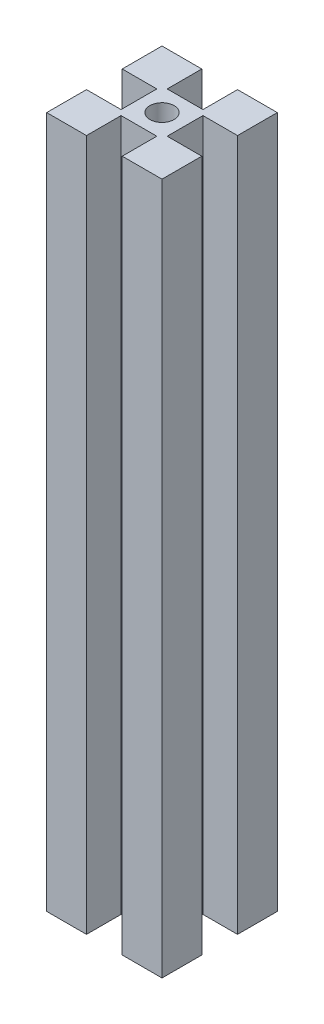
ISO-10303-21;
HEADER;
FILE_DESCRIPTION(('STEP AP214'),'2;1');
FILE_NAME('part.step','',(''),(''),'','','');
FILE_SCHEMA(('AUTOMOTIVE_DESIGN { 1 0 10303 214 1 1 1 1 }'));
ENDSEC;
DATA;
#1=APPLICATION_CONTEXT('core data for automotive mechanical design processes');
#2=APPLICATION_PROTOCOL_DEFINITION('international standard','automotive_design',2000,#1);
#3=PRODUCT_CONTEXT('',#1,'mechanical');
#4=PRODUCT('Part','Part','',(#3));
#5=PRODUCT_RELATED_PRODUCT_CATEGORY('part','',(#4));
#6=PRODUCT_DEFINITION_FORMATION('','',#4);
#7=PRODUCT_DEFINITION_CONTEXT('part definition',#1,'design');
#8=PRODUCT_DEFINITION('design','',#6,#7);
#9=PRODUCT_DEFINITION_SHAPE('','',#8);
#10=(LENGTH_UNIT() NAMED_UNIT(*) SI_UNIT(.MILLI.,.METRE.));
#11=(NAMED_UNIT(*) PLANE_ANGLE_UNIT() SI_UNIT($,.RADIAN.));
#12=(NAMED_UNIT(*) SI_UNIT($,.STERADIAN.) SOLID_ANGLE_UNIT());
#13=UNCERTAINTY_MEASURE_WITH_UNIT(LENGTH_MEASURE(1.E-05),#10,'distance_accuracy_value','');
#14=(GEOMETRIC_REPRESENTATION_CONTEXT(3) GLOBAL_UNCERTAINTY_ASSIGNED_CONTEXT((#13)) GLOBAL_UNIT_ASSIGNED_CONTEXT((#10,
#11,#12)) REPRESENTATION_CONTEXT('',''));
#15=CARTESIAN_POINT('',(0.,0.,0.));
#16=DIRECTION('',(0.,0.,1.));
#17=DIRECTION('',(1.,0.,0.));
#18=AXIS2_PLACEMENT_3D('',#15,#16,#17);
#19=CARTESIAN_POINT('',(0.,120.,0.));
#20=DIRECTION('',(0.,1.,0.));
#21=DIRECTION('',(0.,0.,1.));
#22=AXIS2_PLACEMENT_3D('',#19,#20,#21);
#23=PLANE('',#22);
#24=DIRECTION('',(1.,0.,0.));
#25=VECTOR('',#24,1.);
#26=CARTESIAN_POINT('',(3.1,120.,10.));
#27=LINE('',#26,#25);
#28=CARTESIAN_POINT('',(3.1,120.,10.));
#29=VERTEX_POINT('',#28);
#30=CARTESIAN_POINT('',(10.,120.,10.));
#31=VERTEX_POINT('',#30);
#32=EDGE_CURVE('E250',#29,#31,#27,.T.);
#33=ORIENTED_EDGE('',*,*,#32,.T.);
#34=DIRECTION('',(0.,0.,-1.));
#35=VECTOR('',#34,1.);
#36=CARTESIAN_POINT('',(10.,120.,10.));
#37=LINE('',#36,#35);
#38=CARTESIAN_POINT('',(10.,120.,3.1));
#39=VERTEX_POINT('',#38);
#40=EDGE_CURVE('E134',#31,#39,#37,.T.);
#41=ORIENTED_EDGE('',*,*,#40,.T.);
#42=DIRECTION('',(-1.,0.,0.));
#43=VECTOR('',#42,1.);
#44=CARTESIAN_POINT('',(10.,120.,3.1));
#45=LINE('',#44,#43);
#46=CARTESIAN_POINT('',(4.,120.,3.1));
#47=VERTEX_POINT('',#46);
#48=EDGE_CURVE('E300',#39,#47,#45,.T.);
#49=ORIENTED_EDGE('',*,*,#48,.T.);
#50=DIRECTION('',(0.,0.,-1.));
#51=VECTOR('',#50,1.);
#52=CARTESIAN_POINT('',(4.,120.,3.1));
#53=LINE('',#52,#51);
#54=CARTESIAN_POINT('',(4.,120.,-3.1));
#55=VERTEX_POINT('',#54);
#56=EDGE_CURVE('E320',#47,#55,#53,.T.);
#57=ORIENTED_EDGE('',*,*,#56,.T.);
#58=DIRECTION('',(1.,0.,0.));
#59=VECTOR('',#58,1.);
#60=CARTESIAN_POINT('',(4.,120.,-3.1));
#61=LINE('',#60,#59);
#62=CARTESIAN_POINT('',(10.,120.,-3.1));
#63=VERTEX_POINT('',#62);
#64=EDGE_CURVE('E312',#55,#63,#61,.T.);
#65=ORIENTED_EDGE('',*,*,#64,.T.);
#66=DIRECTION('',(0.,0.,-1.));
#67=VECTOR('',#66,1.);
#68=CARTESIAN_POINT('',(10.,120.,-3.1));
#69=LINE('',#68,#67);
#70=CARTESIAN_POINT('',(10.,120.,-10.));
#71=VERTEX_POINT('',#70);
#72=EDGE_CURVE('E316',#63,#71,#69,.T.);
#73=ORIENTED_EDGE('',*,*,#72,.T.);
#74=DIRECTION('',(-1.,0.,0.));
#75=VECTOR('',#74,1.);
#76=CARTESIAN_POINT('',(10.,120.,-10.));
#77=LINE('',#76,#75);
#78=CARTESIAN_POINT('',(3.1,120.,-10.));
#79=VERTEX_POINT('',#78);
#80=EDGE_CURVE('E317',#71,#79,#77,.T.);
#81=ORIENTED_EDGE('',*,*,#80,.T.);
#82=DIRECTION('',(0.,0.,1.));
#83=VECTOR('',#82,1.);
#84=CARTESIAN_POINT('',(3.1,120.,-10.));
#85=LINE('',#84,#83);
#86=CARTESIAN_POINT('',(3.1,120.,-4.));
#87=VERTEX_POINT('',#86);
#88=EDGE_CURVE('E324',#79,#87,#85,.T.);
#89=ORIENTED_EDGE('',*,*,#88,.T.);
#90=DIRECTION('',(-1.,0.,0.));
#91=VECTOR('',#90,1.);
#92=CARTESIAN_POINT('',(3.1,120.,-4.));
#93=LINE('',#92,#91);
#94=CARTESIAN_POINT('',(-3.1,120.,-4.));
#95=VERTEX_POINT('',#94);
#96=EDGE_CURVE('E330',#87,#95,#93,.T.);
#97=ORIENTED_EDGE('',*,*,#96,.T.);
#98=DIRECTION('',(0.,0.,-1.));
#99=VECTOR('',#98,1.);
#100=CARTESIAN_POINT('',(-3.1,120.,-4.));
#101=LINE('',#100,#99);
#102=CARTESIAN_POINT('',(-3.1,120.,-10.));
#103=VERTEX_POINT('',#102);
#104=EDGE_CURVE('E326',#95,#103,#101,.T.);
#105=ORIENTED_EDGE('',*,*,#104,.T.);
#106=DIRECTION('',(-1.,0.,0.));
#107=VECTOR('',#106,1.);
#108=CARTESIAN_POINT('',(-3.1,120.,-10.));
#109=LINE('',#108,#107);
#110=CARTESIAN_POINT('',(-10.,120.,-10.));
#111=VERTEX_POINT('',#110);
#112=EDGE_CURVE('E332',#103,#111,#109,.T.);
#113=ORIENTED_EDGE('',*,*,#112,.T.);
#114=DIRECTION('',(0.,0.,1.));
#115=VECTOR('',#114,1.);
#116=CARTESIAN_POINT('',(-10.,120.,-10.));
#117=LINE('',#116,#115);
#118=CARTESIAN_POINT('',(-10.,120.,-3.1));
#119=VERTEX_POINT('',#118);
#120=EDGE_CURVE('E335',#111,#119,#117,.T.);
#121=ORIENTED_EDGE('',*,*,#120,.T.);
#122=DIRECTION('',(1.,0.,0.));
#123=VECTOR('',#122,1.);
#124=CARTESIAN_POINT('',(-10.,120.,-3.1));
#125=LINE('',#124,#123);
#126=CARTESIAN_POINT('',(-4.,120.,-3.1));
#127=VERTEX_POINT('',#126);
#128=EDGE_CURVE('E333',#119,#127,#125,.T.);
#129=ORIENTED_EDGE('',*,*,#128,.T.);
#130=DIRECTION('',(0.,0.,1.));
#131=VECTOR('',#130,1.);
#132=CARTESIAN_POINT('',(-4.,120.,-3.1));
#133=LINE('',#132,#131);
#134=CARTESIAN_POINT('',(-4.,120.,3.1));
#135=VERTEX_POINT('',#134);
#136=EDGE_CURVE('E340',#127,#135,#133,.T.);
#137=ORIENTED_EDGE('',*,*,#136,.T.);
#138=DIRECTION('',(-1.,0.,0.));
#139=VECTOR('',#138,1.);
#140=CARTESIAN_POINT('',(-4.,120.,3.1));
#141=LINE('',#140,#139);
#142=CARTESIAN_POINT('',(-10.,120.,3.1));
#143=VERTEX_POINT('',#142);
#144=EDGE_CURVE('E339',#135,#143,#141,.T.);
#145=ORIENTED_EDGE('',*,*,#144,.T.);
#146=DIRECTION('',(0.,0.,1.));
#147=VECTOR('',#146,1.);
#148=CARTESIAN_POINT('',(-10.,120.,3.1));
#149=LINE('',#148,#147);
#150=CARTESIAN_POINT('',(-10.,120.,10.));
#151=VERTEX_POINT('',#150);
#152=EDGE_CURVE('E342',#143,#151,#149,.T.);
#153=ORIENTED_EDGE('',*,*,#152,.T.);
#154=DIRECTION('',(1.,0.,0.));
#155=VECTOR('',#154,1.);
#156=CARTESIAN_POINT('',(-10.,120.,10.));
#157=LINE('',#156,#155);
#158=CARTESIAN_POINT('',(-3.1,120.,10.));
#159=VERTEX_POINT('',#158);
#160=EDGE_CURVE('E189',#151,#159,#157,.T.);
#161=ORIENTED_EDGE('',*,*,#160,.T.);
#162=DIRECTION('',(0.,0.,-1.));
#163=VECTOR('',#162,1.);
#164=CARTESIAN_POINT('',(-3.1,120.,10.));
#165=LINE('',#164,#163);
#166=CARTESIAN_POINT('',(-3.1,120.,4.));
#167=VERTEX_POINT('',#166);
#168=EDGE_CURVE('E182',#159,#167,#165,.T.);
#169=ORIENTED_EDGE('',*,*,#168,.T.);
#170=DIRECTION('',(1.,0.,0.));
#171=VECTOR('',#170,1.);
#172=CARTESIAN_POINT('',(-3.1,120.,4.));
#173=LINE('',#172,#171);
#174=CARTESIAN_POINT('',(3.1,120.,4.));
#175=VERTEX_POINT('',#174);
#176=EDGE_CURVE('E187',#167,#175,#173,.T.);
#177=ORIENTED_EDGE('',*,*,#176,.T.);
#178=DIRECTION('',(0.,0.,1.));
#179=VECTOR('',#178,1.);
#180=CARTESIAN_POINT('',(3.1,120.,4.));
#181=LINE('',#180,#179);
#182=EDGE_CURVE('E57',#175,#29,#181,.T.);
#183=ORIENTED_EDGE('',*,*,#182,.T.);
#184=EDGE_LOOP('',(#33,#41,#49,#57,#65,#73,#81,#89,#97,#105,#113,#121,#129,#137,#145,#153,#161,
#169,#177,#183));
#185=FACE_BOUND('',#184,.T.);
#186=CARTESIAN_POINT('',(0.,120.,0.));
#187=DIRECTION('',(0.,1.,0.));
#188=DIRECTION('',(0.,0.,1.));
#189=AXIS2_PLACEMENT_3D('',#186,#187,#188);
#190=CIRCLE('',#189,2.1);
#191=CARTESIAN_POINT('',(0.,120.,2.1));
#192=VERTEX_POINT('',#191);
#193=EDGE_CURVE('E212',#192,#192,#190,.T.);
#194=ORIENTED_EDGE('',*,*,#193,.F.);
#195=EDGE_LOOP('',(#194));
#196=FACE_BOUND('',#195,.T.);
#197=ADVANCED_FACE('F39',(#185,#196),#23,.T.);
#198=CARTESIAN_POINT('',(0.,0.,0.));
#199=DIRECTION('',(0.,1.,0.));
#200=DIRECTION('',(0.,0.,1.));
#201=AXIS2_PLACEMENT_3D('',#198,#199,#200);
#202=PLANE('',#201);
#203=DIRECTION('',(1.,0.,0.));
#204=VECTOR('',#203,1.);
#205=CARTESIAN_POINT('',(3.1,0.,10.));
#206=LINE('',#205,#204);
#207=CARTESIAN_POINT('',(3.1,0.,10.));
#208=VERTEX_POINT('',#207);
#209=CARTESIAN_POINT('',(10.,0.,10.));
#210=VERTEX_POINT('',#209);
#211=EDGE_CURVE('E210',#208,#210,#206,.T.);
#212=ORIENTED_EDGE('',*,*,#211,.F.);
#213=DIRECTION('',(0.,0.,1.));
#214=VECTOR('',#213,1.);
#215=CARTESIAN_POINT('',(3.1,0.,4.));
#216=LINE('',#215,#214);
#217=CARTESIAN_POINT('',(3.1,0.,4.));
#218=VERTEX_POINT('',#217);
#219=EDGE_CURVE('E130',#218,#208,#216,.T.);
#220=ORIENTED_EDGE('',*,*,#219,.F.);
#221=DIRECTION('',(1.,0.,0.));
#222=VECTOR('',#221,1.);
#223=CARTESIAN_POINT('',(-3.1,0.,4.));
#224=LINE('',#223,#222);
#225=CARTESIAN_POINT('',(-3.1,0.,4.));
#226=VERTEX_POINT('',#225);
#227=EDGE_CURVE('E123',#226,#218,#224,.T.);
#228=ORIENTED_EDGE('',*,*,#227,.F.);
#229=DIRECTION('',(0.,0.,-1.));
#230=VECTOR('',#229,1.);
#231=CARTESIAN_POINT('',(-3.1,0.,10.));
#232=LINE('',#231,#230);
#233=CARTESIAN_POINT('',(-3.1,0.,10.));
#234=VERTEX_POINT('',#233);
#235=EDGE_CURVE('E200',#234,#226,#232,.T.);
#236=ORIENTED_EDGE('',*,*,#235,.F.);
#237=DIRECTION('',(1.,0.,0.));
#238=VECTOR('',#237,1.);
#239=CARTESIAN_POINT('',(-10.,0.,10.));
#240=LINE('',#239,#238);
#241=CARTESIAN_POINT('',(-10.,0.,10.));
#242=VERTEX_POINT('',#241);
#243=EDGE_CURVE('E244',#242,#234,#240,.T.);
#244=ORIENTED_EDGE('',*,*,#243,.F.);
#245=DIRECTION('',(0.,0.,1.));
#246=VECTOR('',#245,1.);
#247=CARTESIAN_POINT('',(-10.,0.,3.1));
#248=LINE('',#247,#246);
#249=CARTESIAN_POINT('',(-10.,0.,3.1));
#250=VERTEX_POINT('',#249);
#251=EDGE_CURVE('E238',#250,#242,#248,.T.);
#252=ORIENTED_EDGE('',*,*,#251,.F.);
#253=DIRECTION('',(-1.,0.,0.));
#254=VECTOR('',#253,1.);
#255=CARTESIAN_POINT('',(-4.,0.,3.1));
#256=LINE('',#255,#254);
#257=CARTESIAN_POINT('',(-4.,0.,3.1));
#258=VERTEX_POINT('',#257);
#259=EDGE_CURVE('E239',#258,#250,#256,.T.);
#260=ORIENTED_EDGE('',*,*,#259,.F.);
#261=DIRECTION('',(0.,0.,1.));
#262=VECTOR('',#261,1.);
#263=CARTESIAN_POINT('',(-4.,0.,-3.1));
#264=LINE('',#263,#262);
#265=CARTESIAN_POINT('',(-4.,0.,-3.1));
#266=VERTEX_POINT('',#265);
#267=EDGE_CURVE('E237',#266,#258,#264,.T.);
#268=ORIENTED_EDGE('',*,*,#267,.F.);
#269=DIRECTION('',(1.,0.,0.));
#270=VECTOR('',#269,1.);
#271=CARTESIAN_POINT('',(-10.,0.,-3.1));
#272=LINE('',#271,#270);
#273=CARTESIAN_POINT('',(-10.,0.,-3.1));
#274=VERTEX_POINT('',#273);
#275=EDGE_CURVE('E233',#274,#266,#272,.T.);
#276=ORIENTED_EDGE('',*,*,#275,.F.);
#277=DIRECTION('',(0.,0.,1.));
#278=VECTOR('',#277,1.);
#279=CARTESIAN_POINT('',(-10.,0.,-10.));
#280=LINE('',#279,#278);
#281=CARTESIAN_POINT('',(-10.,0.,-10.));
#282=VERTEX_POINT('',#281);
#283=EDGE_CURVE('E235',#282,#274,#280,.T.);
#284=ORIENTED_EDGE('',*,*,#283,.F.);
#285=DIRECTION('',(-1.,0.,0.));
#286=VECTOR('',#285,1.);
#287=CARTESIAN_POINT('',(-3.1,0.,-10.));
#288=LINE('',#287,#286);
#289=CARTESIAN_POINT('',(-3.1,0.,-10.));
#290=VERTEX_POINT('',#289);
#291=EDGE_CURVE('E229',#290,#282,#288,.T.);
#292=ORIENTED_EDGE('',*,*,#291,.F.);
#293=DIRECTION('',(0.,0.,-1.));
#294=VECTOR('',#293,1.);
#295=CARTESIAN_POINT('',(-3.1,0.,-4.));
#296=LINE('',#295,#294);
#297=CARTESIAN_POINT('',(-3.1,0.,-4.));
#298=VERTEX_POINT('',#297);
#299=EDGE_CURVE('E228',#298,#290,#296,.T.);
#300=ORIENTED_EDGE('',*,*,#299,.F.);
#301=DIRECTION('',(-1.,0.,0.));
#302=VECTOR('',#301,1.);
#303=CARTESIAN_POINT('',(3.1,0.,-4.));
#304=LINE('',#303,#302);
#305=CARTESIAN_POINT('',(3.1,0.,-4.));
#306=VERTEX_POINT('',#305);
#307=EDGE_CURVE('E226',#306,#298,#304,.T.);
#308=ORIENTED_EDGE('',*,*,#307,.F.);
#309=DIRECTION('',(0.,0.,1.));
#310=VECTOR('',#309,1.);
#311=CARTESIAN_POINT('',(3.1,0.,-10.));
#312=LINE('',#311,#310);
#313=CARTESIAN_POINT('',(3.1,0.,-10.));
#314=VERTEX_POINT('',#313);
#315=EDGE_CURVE('E222',#314,#306,#312,.T.);
#316=ORIENTED_EDGE('',*,*,#315,.F.);
#317=DIRECTION('',(-1.,0.,0.));
#318=VECTOR('',#317,1.);
#319=CARTESIAN_POINT('',(10.,0.,-10.));
#320=LINE('',#319,#318);
#321=CARTESIAN_POINT('',(10.,0.,-10.));
#322=VERTEX_POINT('',#321);
#323=EDGE_CURVE('E225',#322,#314,#320,.T.);
#324=ORIENTED_EDGE('',*,*,#323,.F.);
#325=DIRECTION('',(0.,0.,-1.));
#326=VECTOR('',#325,1.);
#327=CARTESIAN_POINT('',(10.,0.,-3.1));
#328=LINE('',#327,#326);
#329=CARTESIAN_POINT('',(10.,0.,-3.1));
#330=VERTEX_POINT('',#329);
#331=EDGE_CURVE('E217',#330,#322,#328,.T.);
#332=ORIENTED_EDGE('',*,*,#331,.F.);
#333=DIRECTION('',(1.,0.,0.));
#334=VECTOR('',#333,1.);
#335=CARTESIAN_POINT('',(4.,0.,-3.1));
#336=LINE('',#335,#334);
#337=CARTESIAN_POINT('',(4.,0.,-3.1));
#338=VERTEX_POINT('',#337);
#339=EDGE_CURVE('E216',#338,#330,#336,.T.);
#340=ORIENTED_EDGE('',*,*,#339,.F.);
#341=DIRECTION('',(0.,0.,-1.));
#342=VECTOR('',#341,1.);
#343=CARTESIAN_POINT('',(4.,0.,3.1));
#344=LINE('',#343,#342);
#345=CARTESIAN_POINT('',(4.,0.,3.1));
#346=VERTEX_POINT('',#345);
#347=EDGE_CURVE('E218',#346,#338,#344,.T.);
#348=ORIENTED_EDGE('',*,*,#347,.F.);
#349=DIRECTION('',(-1.,0.,0.));
#350=VECTOR('',#349,1.);
#351=CARTESIAN_POINT('',(10.,0.,3.1));
#352=LINE('',#351,#350);
#353=CARTESIAN_POINT('',(10.,0.,3.1));
#354=VERTEX_POINT('',#353);
#355=EDGE_CURVE('E215',#354,#346,#352,.T.);
#356=ORIENTED_EDGE('',*,*,#355,.F.);
#357=DIRECTION('',(0.,0.,-1.));
#358=VECTOR('',#357,1.);
#359=CARTESIAN_POINT('',(10.,0.,10.));
#360=LINE('',#359,#358);
#361=EDGE_CURVE('E213',#210,#354,#360,.T.);
#362=ORIENTED_EDGE('',*,*,#361,.F.);
#363=EDGE_LOOP('',(#212,#220,#228,#236,#244,#252,#260,#268,#276,#284,#292,#300,#308,#316,#324,
#332,#340,#348,#356,#362));
#364=FACE_BOUND('',#363,.T.);
#365=CARTESIAN_POINT('',(0.,0.,0.));
#366=DIRECTION('',(0.,1.,0.));
#367=DIRECTION('',(0.,0.,1.));
#368=AXIS2_PLACEMENT_3D('',#365,#366,#367);
#369=CIRCLE('',#368,2.1);
#370=CARTESIAN_POINT('',(0.,0.,2.1));
#371=VERTEX_POINT('',#370);
#372=EDGE_CURVE('E595',#371,#371,#369,.T.);
#373=ORIENTED_EDGE('',*,*,#372,.T.);
#374=EDGE_LOOP('',(#373));
#375=FACE_BOUND('',#374,.T.);
#376=ADVANCED_FACE('F302',(#364,#375),#202,.F.);
#377=CARTESIAN_POINT('',(3.1,120.,10.));
#378=DIRECTION('',(0.,0.,-1.));
#379=DIRECTION('',(-1.,0.,0.));
#380=AXIS2_PLACEMENT_3D('',#377,#378,#379);
#381=PLANE('',#380);
#382=ORIENTED_EDGE('',*,*,#211,.T.);
#383=DIRECTION('',(0.,-1.,0.));
#384=VECTOR('',#383,1.);
#385=CARTESIAN_POINT('',(10.,120.,10.));
#386=LINE('',#385,#384);
#387=EDGE_CURVE('E11',#31,#210,#386,.T.);
#388=ORIENTED_EDGE('',*,*,#387,.F.);
#389=ORIENTED_EDGE('',*,*,#32,.F.);
#390=DIRECTION('',(0.,-1.,0.));
#391=VECTOR('',#390,1.);
#392=CARTESIAN_POINT('',(3.1,120.,10.));
#393=LINE('',#392,#391);
#394=EDGE_CURVE('E204',#29,#208,#393,.T.);
#395=ORIENTED_EDGE('',*,*,#394,.T.);
#396=EDGE_LOOP('',(#382,#388,#389,#395));
#397=FACE_BOUND('',#396,.T.);
#398=ADVANCED_FACE('F41',(#397),#381,.F.);
#399=CARTESIAN_POINT('',(10.,120.,10.));
#400=DIRECTION('',(-1.,0.,0.));
#401=DIRECTION('',(0.,0.,1.));
#402=AXIS2_PLACEMENT_3D('',#399,#400,#401);
#403=PLANE('',#402);
#404=ORIENTED_EDGE('',*,*,#361,.T.);
#405=DIRECTION('',(0.,-1.,0.));
#406=VECTOR('',#405,1.);
#407=CARTESIAN_POINT('',(10.,120.,3.1));
#408=LINE('',#407,#406);
#409=EDGE_CURVE('E48',#39,#354,#408,.T.);
#410=ORIENTED_EDGE('',*,*,#409,.F.);
#411=ORIENTED_EDGE('',*,*,#40,.F.);
#412=ORIENTED_EDGE('',*,*,#387,.T.);
#413=EDGE_LOOP('',(#404,#410,#411,#412));
#414=FACE_BOUND('',#413,.T.);
#415=ADVANCED_FACE('F373',(#414),#403,.F.);
#416=CARTESIAN_POINT('',(10.,120.,3.1));
#417=DIRECTION('',(0.,0.,1.));
#418=DIRECTION('',(1.,0.,0.));
#419=AXIS2_PLACEMENT_3D('',#416,#417,#418);
#420=PLANE('',#419);
#421=ORIENTED_EDGE('',*,*,#355,.T.);
#422=DIRECTION('',(0.,-1.,0.));
#423=VECTOR('',#422,1.);
#424=CARTESIAN_POINT('',(4.,120.,3.1));
#425=LINE('',#424,#423);
#426=EDGE_CURVE('E288',#47,#346,#425,.T.);
#427=ORIENTED_EDGE('',*,*,#426,.F.);
#428=ORIENTED_EDGE('',*,*,#48,.F.);
#429=ORIENTED_EDGE('',*,*,#409,.T.);
#430=EDGE_LOOP('',(#421,#427,#428,#429));
#431=FACE_BOUND('',#430,.T.);
#432=ADVANCED_FACE('F297',(#431),#420,.F.);
#433=CARTESIAN_POINT('',(4.,120.,3.1));
#434=DIRECTION('',(-1.,0.,0.));
#435=DIRECTION('',(0.,0.,1.));
#436=AXIS2_PLACEMENT_3D('',#433,#434,#435);
#437=PLANE('',#436);
#438=ORIENTED_EDGE('',*,*,#347,.T.);
#439=DIRECTION('',(0.,-1.,0.));
#440=VECTOR('',#439,1.);
#441=CARTESIAN_POINT('',(4.,120.,-3.1));
#442=LINE('',#441,#440);
#443=EDGE_CURVE('E289',#55,#338,#442,.T.);
#444=ORIENTED_EDGE('',*,*,#443,.F.);
#445=ORIENTED_EDGE('',*,*,#56,.F.);
#446=ORIENTED_EDGE('',*,*,#426,.T.);
#447=EDGE_LOOP('',(#438,#444,#445,#446));
#448=FACE_BOUND('',#447,.T.);
#449=ADVANCED_FACE('F306',(#448),#437,.F.);
#450=CARTESIAN_POINT('',(4.,120.,-3.1));
#451=DIRECTION('',(0.,0.,-1.));
#452=DIRECTION('',(-1.,0.,0.));
#453=AXIS2_PLACEMENT_3D('',#450,#451,#452);
#454=PLANE('',#453);
#455=ORIENTED_EDGE('',*,*,#339,.T.);
#456=DIRECTION('',(0.,-1.,0.));
#457=VECTOR('',#456,1.);
#458=CARTESIAN_POINT('',(10.,120.,-3.1));
#459=LINE('',#458,#457);
#460=EDGE_CURVE('E281',#63,#330,#459,.T.);
#461=ORIENTED_EDGE('',*,*,#460,.F.);
#462=ORIENTED_EDGE('',*,*,#64,.F.);
#463=ORIENTED_EDGE('',*,*,#443,.T.);
#464=EDGE_LOOP('',(#455,#461,#462,#463));
#465=FACE_BOUND('',#464,.T.);
#466=ADVANCED_FACE('F315',(#465),#454,.F.);
#467=CARTESIAN_POINT('',(10.,120.,-3.1));
#468=DIRECTION('',(-1.,0.,0.));
#469=DIRECTION('',(0.,0.,1.));
#470=AXIS2_PLACEMENT_3D('',#467,#468,#469);
#471=PLANE('',#470);
#472=ORIENTED_EDGE('',*,*,#331,.T.);
#473=DIRECTION('',(0.,-1.,0.));
#474=VECTOR('',#473,1.);
#475=CARTESIAN_POINT('',(10.,120.,-10.));
#476=LINE('',#475,#474);
#477=EDGE_CURVE('E282',#71,#322,#476,.T.);
#478=ORIENTED_EDGE('',*,*,#477,.F.);
#479=ORIENTED_EDGE('',*,*,#72,.F.);
#480=ORIENTED_EDGE('',*,*,#460,.T.);
#481=EDGE_LOOP('',(#472,#478,#479,#480));
#482=FACE_BOUND('',#481,.T.);
#483=ADVANCED_FACE('F390',(#482),#471,.F.);
#484=CARTESIAN_POINT('',(10.,120.,-10.));
#485=DIRECTION('',(0.,0.,1.));
#486=DIRECTION('',(1.,0.,0.));
#487=AXIS2_PLACEMENT_3D('',#484,#485,#486);
#488=PLANE('',#487);
#489=ORIENTED_EDGE('',*,*,#323,.T.);
#490=DIRECTION('',(0.,-1.,0.));
#491=VECTOR('',#490,1.);
#492=CARTESIAN_POINT('',(3.1,120.,-10.));
#493=LINE('',#492,#491);
#494=EDGE_CURVE('E277',#79,#314,#493,.T.);
#495=ORIENTED_EDGE('',*,*,#494,.F.);
#496=ORIENTED_EDGE('',*,*,#80,.F.);
#497=ORIENTED_EDGE('',*,*,#477,.T.);
#498=EDGE_LOOP('',(#489,#495,#496,#497));
#499=FACE_BOUND('',#498,.T.);
#500=ADVANCED_FACE('F393',(#499),#488,.F.);
#501=CARTESIAN_POINT('',(3.1,120.,-10.));
#502=DIRECTION('',(1.,0.,0.));
#503=DIRECTION('',(0.,0.,-1.));
#504=AXIS2_PLACEMENT_3D('',#501,#502,#503);
#505=PLANE('',#504);
#506=ORIENTED_EDGE('',*,*,#315,.T.);
#507=DIRECTION('',(0.,-1.,0.));
#508=VECTOR('',#507,1.);
#509=CARTESIAN_POINT('',(3.1,120.,-4.));
#510=LINE('',#509,#508);
#511=EDGE_CURVE('E274',#87,#306,#510,.T.);
#512=ORIENTED_EDGE('',*,*,#511,.F.);
#513=ORIENTED_EDGE('',*,*,#88,.F.);
#514=ORIENTED_EDGE('',*,*,#494,.T.);
#515=EDGE_LOOP('',(#506,#512,#513,#514));
#516=FACE_BOUND('',#515,.T.);
#517=ADVANCED_FACE('F394',(#516),#505,.F.);
#518=CARTESIAN_POINT('',(3.1,120.,-4.));
#519=DIRECTION('',(0.,0.,1.));
#520=DIRECTION('',(1.,0.,0.));
#521=AXIS2_PLACEMENT_3D('',#518,#519,#520);
#522=PLANE('',#521);
#523=ORIENTED_EDGE('',*,*,#307,.T.);
#524=DIRECTION('',(0.,-1.,0.));
#525=VECTOR('',#524,1.);
#526=CARTESIAN_POINT('',(-3.1,120.,-4.));
#527=LINE('',#526,#525);
#528=EDGE_CURVE('E275',#95,#298,#527,.T.);
#529=ORIENTED_EDGE('',*,*,#528,.F.);
#530=ORIENTED_EDGE('',*,*,#96,.F.);
#531=ORIENTED_EDGE('',*,*,#511,.T.);
#532=EDGE_LOOP('',(#523,#529,#530,#531));
#533=FACE_BOUND('',#532,.T.);
#534=ADVANCED_FACE('F399',(#533),#522,.F.);
#535=CARTESIAN_POINT('',(-3.1,120.,-4.));
#536=DIRECTION('',(-1.,0.,0.));
#537=DIRECTION('',(0.,0.,1.));
#538=AXIS2_PLACEMENT_3D('',#535,#536,#537);
#539=PLANE('',#538);
#540=ORIENTED_EDGE('',*,*,#299,.T.);
#541=DIRECTION('',(0.,-1.,0.));
#542=VECTOR('',#541,1.);
#543=CARTESIAN_POINT('',(-3.1,120.,-10.));
#544=LINE('',#543,#542);
#545=EDGE_CURVE('E267',#103,#290,#544,.T.);
#546=ORIENTED_EDGE('',*,*,#545,.F.);
#547=ORIENTED_EDGE('',*,*,#104,.F.);
#548=ORIENTED_EDGE('',*,*,#528,.T.);
#549=EDGE_LOOP('',(#540,#546,#547,#548));
#550=FACE_BOUND('',#549,.T.);
#551=ADVANCED_FACE('F403',(#550),#539,.F.);
#552=CARTESIAN_POINT('',(-3.1,120.,-10.));
#553=DIRECTION('',(0.,0.,1.));
#554=DIRECTION('',(1.,0.,0.));
#555=AXIS2_PLACEMENT_3D('',#552,#553,#554);
#556=PLANE('',#555);
#557=ORIENTED_EDGE('',*,*,#291,.T.);
#558=DIRECTION('',(0.,-1.,0.));
#559=VECTOR('',#558,1.);
#560=CARTESIAN_POINT('',(-10.,120.,-10.));
#561=LINE('',#560,#559);
#562=EDGE_CURVE('E266',#111,#282,#561,.T.);
#563=ORIENTED_EDGE('',*,*,#562,.F.);
#564=ORIENTED_EDGE('',*,*,#112,.F.);
#565=ORIENTED_EDGE('',*,*,#545,.T.);
#566=EDGE_LOOP('',(#557,#563,#564,#565));
#567=FACE_BOUND('',#566,.T.);
#568=ADVANCED_FACE('F410',(#567),#556,.F.);
#569=CARTESIAN_POINT('',(-10.,120.,-10.));
#570=DIRECTION('',(1.,0.,0.));
#571=DIRECTION('',(0.,0.,-1.));
#572=AXIS2_PLACEMENT_3D('',#569,#570,#571);
#573=PLANE('',#572);
#574=ORIENTED_EDGE('',*,*,#283,.T.);
#575=DIRECTION('',(0.,-1.,0.));
#576=VECTOR('',#575,1.);
#577=CARTESIAN_POINT('',(-10.,120.,-3.1));
#578=LINE('',#577,#576);
#579=EDGE_CURVE('E261',#119,#274,#578,.T.);
#580=ORIENTED_EDGE('',*,*,#579,.F.);
#581=ORIENTED_EDGE('',*,*,#120,.F.);
#582=ORIENTED_EDGE('',*,*,#562,.T.);
#583=EDGE_LOOP('',(#574,#580,#581,#582));
#584=FACE_BOUND('',#583,.T.);
#585=ADVANCED_FACE('F411',(#584),#573,.F.);
#586=CARTESIAN_POINT('',(-10.,120.,-3.1));
#587=DIRECTION('',(0.,0.,-1.));
#588=DIRECTION('',(-1.,0.,0.));
#589=AXIS2_PLACEMENT_3D('',#586,#587,#588);
#590=PLANE('',#589);
#591=ORIENTED_EDGE('',*,*,#275,.T.);
#592=DIRECTION('',(0.,-1.,0.));
#593=VECTOR('',#592,1.);
#594=CARTESIAN_POINT('',(-4.,120.,-3.1));
#595=LINE('',#594,#593);
#596=EDGE_CURVE('E259',#127,#266,#595,.T.);
#597=ORIENTED_EDGE('',*,*,#596,.F.);
#598=ORIENTED_EDGE('',*,*,#128,.F.);
#599=ORIENTED_EDGE('',*,*,#579,.T.);
#600=EDGE_LOOP('',(#591,#597,#598,#599));
#601=FACE_BOUND('',#600,.T.);
#602=ADVANCED_FACE('F414',(#601),#590,.F.);
#603=CARTESIAN_POINT('',(-4.,120.,-3.1));
#604=DIRECTION('',(1.,0.,0.));
#605=DIRECTION('',(0.,0.,-1.));
#606=AXIS2_PLACEMENT_3D('',#603,#604,#605);
#607=PLANE('',#606);
#608=ORIENTED_EDGE('',*,*,#267,.T.);
#609=DIRECTION('',(0.,-1.,0.));
#610=VECTOR('',#609,1.);
#611=CARTESIAN_POINT('',(-4.,120.,3.1));
#612=LINE('',#611,#610);
#613=EDGE_CURVE('E257',#135,#258,#612,.T.);
#614=ORIENTED_EDGE('',*,*,#613,.F.);
#615=ORIENTED_EDGE('',*,*,#136,.F.);
#616=ORIENTED_EDGE('',*,*,#596,.T.);
#617=EDGE_LOOP('',(#608,#614,#615,#616));
#618=FACE_BOUND('',#617,.T.);
#619=ADVANCED_FACE('F416',(#618),#607,.F.);
#620=CARTESIAN_POINT('',(-4.,120.,3.1));
#621=DIRECTION('',(0.,0.,1.));
#622=DIRECTION('',(1.,0.,0.));
#623=AXIS2_PLACEMENT_3D('',#620,#621,#622);
#624=PLANE('',#623);
#625=ORIENTED_EDGE('',*,*,#259,.T.);
#626=DIRECTION('',(0.,-1.,0.));
#627=VECTOR('',#626,1.);
#628=CARTESIAN_POINT('',(-10.,120.,3.1));
#629=LINE('',#628,#627);
#630=EDGE_CURVE('E251',#143,#250,#629,.T.);
#631=ORIENTED_EDGE('',*,*,#630,.F.);
#632=ORIENTED_EDGE('',*,*,#144,.F.);
#633=ORIENTED_EDGE('',*,*,#613,.T.);
#634=EDGE_LOOP('',(#625,#631,#632,#633));
#635=FACE_BOUND('',#634,.T.);
#636=ADVANCED_FACE('F425',(#635),#624,.F.);
#637=CARTESIAN_POINT('',(-10.,120.,3.1));
#638=DIRECTION('',(1.,0.,0.));
#639=DIRECTION('',(0.,0.,-1.));
#640=AXIS2_PLACEMENT_3D('',#637,#638,#639);
#641=PLANE('',#640);
#642=ORIENTED_EDGE('',*,*,#251,.T.);
#643=DIRECTION('',(0.,-1.,0.));
#644=VECTOR('',#643,1.);
#645=CARTESIAN_POINT('',(-10.,120.,10.));
#646=LINE('',#645,#644);
#647=EDGE_CURVE('E252',#151,#242,#646,.T.);
#648=ORIENTED_EDGE('',*,*,#647,.F.);
#649=ORIENTED_EDGE('',*,*,#152,.F.);
#650=ORIENTED_EDGE('',*,*,#630,.T.);
#651=EDGE_LOOP('',(#642,#648,#649,#650));
#652=FACE_BOUND('',#651,.T.);
#653=ADVANCED_FACE('F347',(#652),#641,.F.);
#654=CARTESIAN_POINT('',(-10.,120.,10.));
#655=DIRECTION('',(0.,0.,-1.));
#656=DIRECTION('',(-1.,0.,0.));
#657=AXIS2_PLACEMENT_3D('',#654,#655,#656);
#658=PLANE('',#657);
#659=ORIENTED_EDGE('',*,*,#243,.T.);
#660=DIRECTION('',(0.,-1.,0.));
#661=VECTOR('',#660,1.);
#662=CARTESIAN_POINT('',(-3.1,120.,10.));
#663=LINE('',#662,#661);
#664=EDGE_CURVE('E196',#159,#234,#663,.T.);
#665=ORIENTED_EDGE('',*,*,#664,.F.);
#666=ORIENTED_EDGE('',*,*,#160,.F.);
#667=ORIENTED_EDGE('',*,*,#647,.T.);
#668=EDGE_LOOP('',(#659,#665,#666,#667));
#669=FACE_BOUND('',#668,.T.);
#670=ADVANCED_FACE('F353',(#669),#658,.F.);
#671=CARTESIAN_POINT('',(-3.1,120.,10.));
#672=DIRECTION('',(-1.,0.,0.));
#673=DIRECTION('',(0.,0.,1.));
#674=AXIS2_PLACEMENT_3D('',#671,#672,#673);
#675=PLANE('',#674);
#676=ORIENTED_EDGE('',*,*,#235,.T.);
#677=DIRECTION('',(0.,-1.,0.));
#678=VECTOR('',#677,1.);
#679=CARTESIAN_POINT('',(-3.1,120.,4.));
#680=LINE('',#679,#678);
#681=EDGE_CURVE('E193',#167,#226,#680,.T.);
#682=ORIENTED_EDGE('',*,*,#681,.F.);
#683=ORIENTED_EDGE('',*,*,#168,.F.);
#684=ORIENTED_EDGE('',*,*,#664,.T.);
#685=EDGE_LOOP('',(#676,#682,#683,#684));
#686=FACE_BOUND('',#685,.T.);
#687=ADVANCED_FACE('F197',(#686),#675,.F.);
#688=CARTESIAN_POINT('',(-3.1,120.,4.));
#689=DIRECTION('',(0.,0.,-1.));
#690=DIRECTION('',(-1.,0.,0.));
#691=AXIS2_PLACEMENT_3D('',#688,#689,#690);
#692=PLANE('',#691);
#693=ORIENTED_EDGE('',*,*,#227,.T.);
#694=DIRECTION('',(0.,-1.,0.));
#695=VECTOR('',#694,1.);
#696=CARTESIAN_POINT('',(3.1,120.,4.));
#697=LINE('',#696,#695);
#698=EDGE_CURVE('E198',#175,#218,#697,.T.);
#699=ORIENTED_EDGE('',*,*,#698,.F.);
#700=ORIENTED_EDGE('',*,*,#176,.F.);
#701=ORIENTED_EDGE('',*,*,#681,.T.);
#702=EDGE_LOOP('',(#693,#699,#700,#701));
#703=FACE_BOUND('',#702,.T.);
#704=ADVANCED_FACE('F205',(#703),#692,.F.);
#705=CARTESIAN_POINT('',(3.1,120.,4.));
#706=DIRECTION('',(1.,0.,0.));
#707=DIRECTION('',(0.,0.,-1.));
#708=AXIS2_PLACEMENT_3D('',#705,#706,#707);
#709=PLANE('',#708);
#710=ORIENTED_EDGE('',*,*,#219,.T.);
#711=ORIENTED_EDGE('',*,*,#394,.F.);
#712=ORIENTED_EDGE('',*,*,#182,.F.);
#713=ORIENTED_EDGE('',*,*,#698,.T.);
#714=EDGE_LOOP('',(#710,#711,#712,#713));
#715=FACE_BOUND('',#714,.T.);
#716=ADVANCED_FACE('F352',(#715),#709,.F.);
#717=CARTESIAN_POINT('',(0.,120.,0.));
#718=DIRECTION('',(0.,-1.,0.));
#719=DIRECTION('',(0.,0.,-1.));
#720=AXIS2_PLACEMENT_3D('',#717,#718,#719);
#721=CYLINDRICAL_SURFACE('',#720,2.1);
#722=ORIENTED_EDGE('',*,*,#193,.T.);
#723=EDGE_LOOP('',(#722));
#724=FACE_BOUND('',#723,.T.);
#725=ORIENTED_EDGE('',*,*,#372,.F.);
#726=EDGE_LOOP('',(#725));
#727=FACE_BOUND('',#726,.T.);
#728=ADVANCED_FACE('F360',(#724,#727),#721,.F.);
#729=CLOSED_SHELL('',(#197,#376,#398,#415,#432,#449,#466,#483,#500,#517,#534,#551,#568,#585,
#602,#619,#636,#653,#670,#687,#704,#716,#728));
#730=MANIFOLD_SOLID_BREP('B2',#729);
#731=ADVANCED_BREP_SHAPE_REPRESENTATION('',(#18,#730),#14);
#732=SHAPE_DEFINITION_REPRESENTATION(#9,#731);
ENDSEC;
END-ISO-10303-21;
